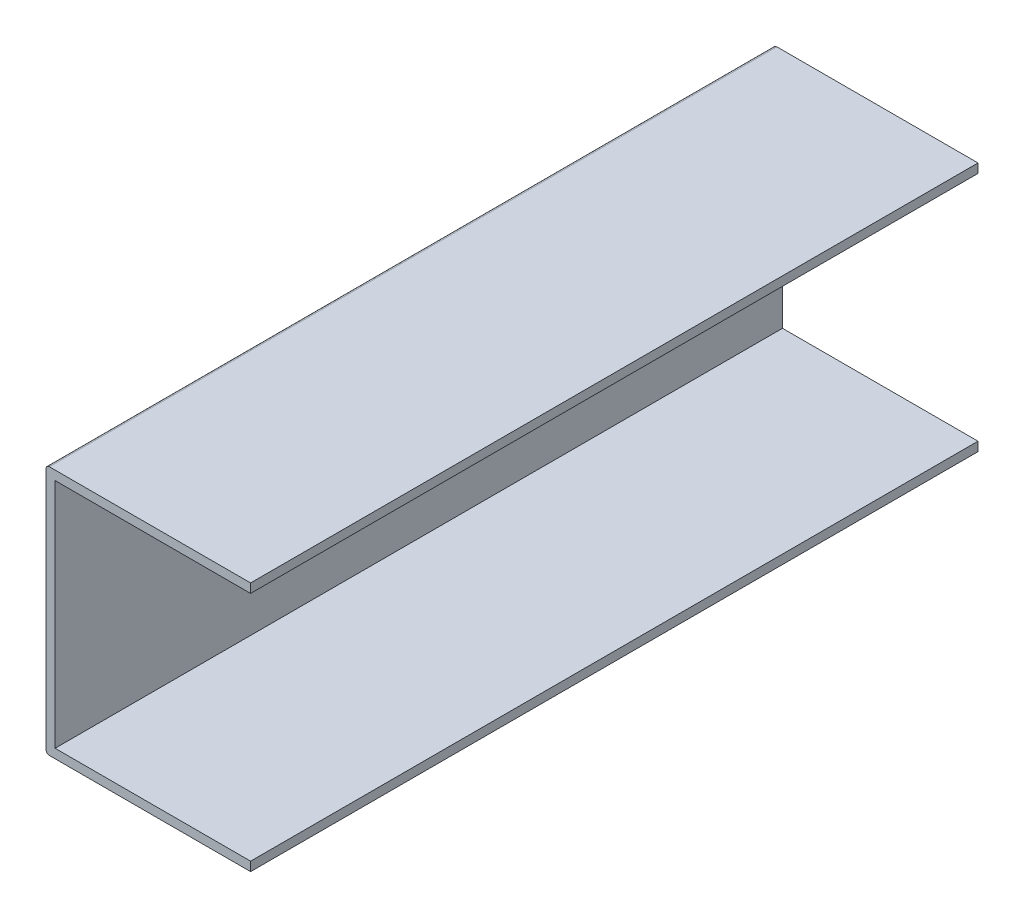
ISO-10303-21;
HEADER;
FILE_DESCRIPTION(('STEP AP214'),'2;1');
FILE_NAME('part.step','',(''),(''),'','','');
FILE_SCHEMA(('AUTOMOTIVE_DESIGN { 1 0 10303 214 1 1 1 1 }'));
ENDSEC;
DATA;
#1=APPLICATION_CONTEXT('core data for automotive mechanical design processes');
#2=APPLICATION_PROTOCOL_DEFINITION('international standard','automotive_design',2000,#1);
#3=PRODUCT_CONTEXT('',#1,'mechanical');
#4=PRODUCT('Part','Part','',(#3));
#5=PRODUCT_RELATED_PRODUCT_CATEGORY('part','',(#4));
#6=PRODUCT_DEFINITION_FORMATION('','',#4);
#7=PRODUCT_DEFINITION_CONTEXT('part definition',#1,'design');
#8=PRODUCT_DEFINITION('design','',#6,#7);
#9=PRODUCT_DEFINITION_SHAPE('','',#8);
#10=(LENGTH_UNIT() NAMED_UNIT(*) SI_UNIT(.MILLI.,.METRE.));
#11=(NAMED_UNIT(*) PLANE_ANGLE_UNIT() SI_UNIT($,.RADIAN.));
#12=(NAMED_UNIT(*) SI_UNIT($,.STERADIAN.) SOLID_ANGLE_UNIT());
#13=UNCERTAINTY_MEASURE_WITH_UNIT(LENGTH_MEASURE(1.E-05),#10,'distance_accuracy_value','');
#14=(GEOMETRIC_REPRESENTATION_CONTEXT(3) GLOBAL_UNCERTAINTY_ASSIGNED_CONTEXT((#13)) GLOBAL_UNIT_ASSIGNED_CONTEXT((#10,
#11,#12)) REPRESENTATION_CONTEXT('',''));
#15=CARTESIAN_POINT('',(0.,0.,0.));
#16=DIRECTION('',(0.,0.,1.));
#17=DIRECTION('',(1.,0.,0.));
#18=AXIS2_PLACEMENT_3D('',#15,#16,#17);
#19=CARTESIAN_POINT('',(-0.205,0.,-1.6));
#20=DIRECTION('',(-1.,0.,0.));
#21=DIRECTION('',(0.,1.,0.));
#22=AXIS2_PLACEMENT_3D('',#19,#20,#21);
#23=PLANE('',#22);
#24=DIRECTION('',(0.,0.,-1.));
#25=VECTOR('',#24,1.);
#26=CARTESIAN_POINT('',(-0.205,-0.255,-1.6));
#27=LINE('',#26,#25);
#28=CARTESIAN_POINT('',(-0.205,-0.255,0.));
#29=VERTEX_POINT('',#28);
#30=CARTESIAN_POINT('',(-0.205,-0.255,-1.6));
#31=VERTEX_POINT('',#30);
#32=EDGE_CURVE('E28',#29,#31,#27,.T.);
#33=ORIENTED_EDGE('',*,*,#32,.T.);
#34=DIRECTION('',(0.,-1.,0.));
#35=VECTOR('',#34,1.);
#36=CARTESIAN_POINT('',(-0.205,0.,-1.6));
#37=LINE('',#36,#35);
#38=CARTESIAN_POINT('',(-0.205,0.255,-1.6));
#39=VERTEX_POINT('',#38);
#40=EDGE_CURVE('E204',#39,#31,#37,.T.);
#41=ORIENTED_EDGE('',*,*,#40,.F.);
#42=DIRECTION('',(0.,0.,-1.));
#43=VECTOR('',#42,1.);
#44=CARTESIAN_POINT('',(-0.205,0.255,-1.6));
#45=LINE('',#44,#43);
#46=CARTESIAN_POINT('',(-0.205,0.255,0.));
#47=VERTEX_POINT('',#46);
#48=EDGE_CURVE('E11',#47,#39,#45,.T.);
#49=ORIENTED_EDGE('',*,*,#48,.F.);
#50=DIRECTION('',(0.,1.,0.));
#51=VECTOR('',#50,1.);
#52=CARTESIAN_POINT('',(-0.205,0.,0.));
#53=LINE('',#52,#51);
#54=EDGE_CURVE('E214',#29,#47,#53,.T.);
#55=ORIENTED_EDGE('',*,*,#54,.F.);
#56=EDGE_LOOP('',(#33,#41,#49,#55));
#57=FACE_BOUND('',#56,.T.);
#58=ADVANCED_FACE('F17',(#57),#23,.F.);
#59=CARTESIAN_POINT('',(0.,0.255,-1.6));
#60=DIRECTION('',(0.,-1.,0.));
#61=DIRECTION('',(0.,0.,-1.));
#62=AXIS2_PLACEMENT_3D('',#59,#60,#61);
#63=PLANE('',#62);
#64=DIRECTION('',(1.,0.,0.));
#65=VECTOR('',#64,1.);
#66=CARTESIAN_POINT('',(0.,0.255,-1.6));
#67=LINE('',#66,#65);
#68=CARTESIAN_POINT('',(0.225,0.255,-1.6));
#69=VERTEX_POINT('',#68);
#70=EDGE_CURVE('E225',#39,#69,#67,.T.);
#71=ORIENTED_EDGE('',*,*,#70,.T.);
#72=DIRECTION('',(0.,0.,-1.));
#73=VECTOR('',#72,1.);
#74=CARTESIAN_POINT('',(0.225,0.255,-1.6));
#75=LINE('',#74,#73);
#76=CARTESIAN_POINT('',(0.225,0.255,0.));
#77=VERTEX_POINT('',#76);
#78=EDGE_CURVE('E42',#77,#69,#75,.T.);
#79=ORIENTED_EDGE('',*,*,#78,.F.);
#80=DIRECTION('',(-1.,0.,0.));
#81=VECTOR('',#80,1.);
#82=CARTESIAN_POINT('',(0.,0.255,0.));
#83=LINE('',#82,#81);
#84=EDGE_CURVE('E192',#77,#47,#83,.T.);
#85=ORIENTED_EDGE('',*,*,#84,.T.);
#86=ORIENTED_EDGE('',*,*,#48,.T.);
#87=EDGE_LOOP('',(#71,#79,#85,#86));
#88=FACE_BOUND('',#87,.T.);
#89=ADVANCED_FACE('F417',(#88),#63,.T.);
#90=CARTESIAN_POINT('',(0.,-0.255,-1.6));
#91=DIRECTION('',(0.,-1.,0.));
#92=DIRECTION('',(0.,0.,-1.));
#93=AXIS2_PLACEMENT_3D('',#90,#91,#92);
#94=PLANE('',#93);
#95=DIRECTION('',(0.,0.,1.));
#96=VECTOR('',#95,1.);
#97=CARTESIAN_POINT('',(0.225,-0.255,-1.6));
#98=LINE('',#97,#96);
#99=CARTESIAN_POINT('',(0.225,-0.255,-1.6));
#100=VERTEX_POINT('',#99);
#101=CARTESIAN_POINT('',(0.225,-0.255,0.));
#102=VERTEX_POINT('',#101);
#103=EDGE_CURVE('E220',#100,#102,#98,.T.);
#104=ORIENTED_EDGE('',*,*,#103,.F.);
#105=DIRECTION('',(1.,0.,0.));
#106=VECTOR('',#105,1.);
#107=CARTESIAN_POINT('',(0.,-0.255,-1.6));
#108=LINE('',#107,#106);
#109=EDGE_CURVE('E200',#31,#100,#108,.T.);
#110=ORIENTED_EDGE('',*,*,#109,.F.);
#111=ORIENTED_EDGE('',*,*,#32,.F.);
#112=DIRECTION('',(-1.,0.,0.));
#113=VECTOR('',#112,1.);
#114=CARTESIAN_POINT('',(0.,-0.255,0.));
#115=LINE('',#114,#113);
#116=EDGE_CURVE('E210',#102,#29,#115,.T.);
#117=ORIENTED_EDGE('',*,*,#116,.F.);
#118=EDGE_LOOP('',(#104,#110,#111,#117));
#119=FACE_BOUND('',#118,.T.);
#120=ADVANCED_FACE('F253',(#119),#94,.F.);
#121=CARTESIAN_POINT('',(0.225,0.,-1.6));
#122=DIRECTION('',(1.,0.,0.));
#123=DIRECTION('',(0.,1.,0.));
#124=AXIS2_PLACEMENT_3D('',#121,#122,#123);
#125=PLANE('',#124);
#126=DIRECTION('',(0.,1.,0.));
#127=VECTOR('',#126,1.);
#128=CARTESIAN_POINT('',(0.225,0.,-1.6));
#129=LINE('',#128,#127);
#130=CARTESIAN_POINT('',(0.225,0.275,-1.6));
#131=VERTEX_POINT('',#130);
#132=EDGE_CURVE('E173',#69,#131,#129,.T.);
#133=ORIENTED_EDGE('',*,*,#132,.T.);
#134=DIRECTION('',(0.,0.,1.));
#135=VECTOR('',#134,1.);
#136=CARTESIAN_POINT('',(0.225,0.275,-1.6));
#137=LINE('',#136,#135);
#138=CARTESIAN_POINT('',(0.225,0.275,0.));
#139=VERTEX_POINT('',#138);
#140=EDGE_CURVE('E95',#131,#139,#137,.T.);
#141=ORIENTED_EDGE('',*,*,#140,.T.);
#142=DIRECTION('',(0.,-1.,0.));
#143=VECTOR('',#142,1.);
#144=CARTESIAN_POINT('',(0.225,0.,0.));
#145=LINE('',#144,#143);
#146=EDGE_CURVE('E190',#139,#77,#145,.T.);
#147=ORIENTED_EDGE('',*,*,#146,.T.);
#148=ORIENTED_EDGE('',*,*,#78,.T.);
#149=EDGE_LOOP('',(#133,#141,#147,#148));
#150=FACE_BOUND('',#149,.T.);
#151=ADVANCED_FACE('F400',(#150),#125,.T.);
#152=CARTESIAN_POINT('',(0.225,0.,-1.6));
#153=DIRECTION('',(1.,0.,0.));
#154=DIRECTION('',(0.,1.,0.));
#155=AXIS2_PLACEMENT_3D('',#152,#153,#154);
#156=PLANE('',#155);
#157=DIRECTION('',(0.,1.,0.));
#158=VECTOR('',#157,1.);
#159=CARTESIAN_POINT('',(0.225,0.,-1.6));
#160=LINE('',#159,#158);
#161=CARTESIAN_POINT('',(0.225,-0.275,-1.6));
#162=VERTEX_POINT('',#161);
#163=EDGE_CURVE('E183',#162,#100,#160,.T.);
#164=ORIENTED_EDGE('',*,*,#163,.T.);
#165=ORIENTED_EDGE('',*,*,#103,.T.);
#166=DIRECTION('',(0.,-1.,0.));
#167=VECTOR('',#166,1.);
#168=CARTESIAN_POINT('',(0.225,0.,0.));
#169=LINE('',#168,#167);
#170=CARTESIAN_POINT('',(0.225,-0.275,0.));
#171=VERTEX_POINT('',#170);
#172=EDGE_CURVE('E189',#102,#171,#169,.T.);
#173=ORIENTED_EDGE('',*,*,#172,.T.);
#174=DIRECTION('',(0.,0.,1.));
#175=VECTOR('',#174,1.);
#176=CARTESIAN_POINT('',(0.225,-0.275,-1.6));
#177=LINE('',#176,#175);
#178=EDGE_CURVE('E184',#162,#171,#177,.T.);
#179=ORIENTED_EDGE('',*,*,#178,.F.);
#180=EDGE_LOOP('',(#164,#165,#173,#179));
#181=FACE_BOUND('',#180,.T.);
#182=ADVANCED_FACE('F248',(#181),#156,.T.);
#183=CARTESIAN_POINT('',(0.,0.275,-1.6));
#184=DIRECTION('',(0.,-1.,0.));
#185=DIRECTION('',(0.,0.,-1.));
#186=AXIS2_PLACEMENT_3D('',#183,#184,#185);
#187=PLANE('',#186);
#188=DIRECTION('',(0.,0.,-1.));
#189=VECTOR('',#188,1.);
#190=CARTESIAN_POINT('',(-0.2175,0.275,-1.6));
#191=LINE('',#190,#189);
#192=CARTESIAN_POINT('',(-0.2175,0.275,0.));
#193=VERTEX_POINT('',#192);
#194=CARTESIAN_POINT('',(-0.2175,0.275,-1.6));
#195=VERTEX_POINT('',#194);
#196=EDGE_CURVE('E120',#193,#195,#191,.T.);
#197=ORIENTED_EDGE('',*,*,#196,.F.);
#198=DIRECTION('',(-1.,0.,0.));
#199=VECTOR('',#198,1.);
#200=CARTESIAN_POINT('',(0.,0.275,0.));
#201=LINE('',#200,#199);
#202=EDGE_CURVE('E149',#139,#193,#201,.T.);
#203=ORIENTED_EDGE('',*,*,#202,.F.);
#204=ORIENTED_EDGE('',*,*,#140,.F.);
#205=DIRECTION('',(1.,0.,0.));
#206=VECTOR('',#205,1.);
#207=CARTESIAN_POINT('',(0.,0.275,-1.6));
#208=LINE('',#207,#206);
#209=EDGE_CURVE('E196',#195,#131,#208,.T.);
#210=ORIENTED_EDGE('',*,*,#209,.F.);
#211=EDGE_LOOP('',(#197,#203,#204,#210));
#212=FACE_BOUND('',#211,.T.);
#213=ADVANCED_FACE('F381',(#212),#187,.F.);
#214=CARTESIAN_POINT('',(0.,-0.275,-1.6));
#215=DIRECTION('',(0.,-1.,0.));
#216=DIRECTION('',(0.,0.,-1.));
#217=AXIS2_PLACEMENT_3D('',#214,#215,#216);
#218=PLANE('',#217);
#219=DIRECTION('',(1.,0.,0.));
#220=VECTOR('',#219,1.);
#221=CARTESIAN_POINT('',(0.,-0.275,-1.6));
#222=LINE('',#221,#220);
#223=CARTESIAN_POINT('',(-0.2175,-0.275,-1.6));
#224=VERTEX_POINT('',#223);
#225=EDGE_CURVE('E178',#224,#162,#222,.T.);
#226=ORIENTED_EDGE('',*,*,#225,.T.);
#227=ORIENTED_EDGE('',*,*,#178,.T.);
#228=DIRECTION('',(1.,0.,0.));
#229=VECTOR('',#228,1.);
#230=CARTESIAN_POINT('',(0.,-0.275,0.));
#231=LINE('',#230,#229);
#232=CARTESIAN_POINT('',(-0.2175,-0.275,0.));
#233=VERTEX_POINT('',#232);
#234=EDGE_CURVE('E83',#233,#171,#231,.T.);
#235=ORIENTED_EDGE('',*,*,#234,.F.);
#236=DIRECTION('',(0.,0.,1.));
#237=VECTOR('',#236,1.);
#238=CARTESIAN_POINT('',(-0.2175,-0.275,-1.6));
#239=LINE('',#238,#237);
#240=EDGE_CURVE('E21',#224,#233,#239,.T.);
#241=ORIENTED_EDGE('',*,*,#240,.F.);
#242=EDGE_LOOP('',(#226,#227,#235,#241));
#243=FACE_BOUND('',#242,.T.);
#244=ADVANCED_FACE('F372',(#243),#218,.T.);
#245=CARTESIAN_POINT('',(-0.2175,0.2675,-1.6));
#246=DIRECTION('',(0.,0.,1.));
#247=DIRECTION('',(1.,0.,0.));
#248=AXIS2_PLACEMENT_3D('',#245,#246,#247);
#249=CYLINDRICAL_SURFACE('',#248,0.0075);
#250=CARTESIAN_POINT('',(-0.2175,0.2675,0.));
#251=DIRECTION('',(0.,0.,1.));
#252=DIRECTION('',(1.,0.,0.));
#253=AXIS2_PLACEMENT_3D('',#250,#251,#252);
#254=CIRCLE('',#253,0.0075);
#255=CARTESIAN_POINT('',(-0.225,0.2675,0.));
#256=VERTEX_POINT('',#255);
#257=EDGE_CURVE('E141',#193,#256,#254,.T.);
#258=ORIENTED_EDGE('',*,*,#257,.F.);
#259=ORIENTED_EDGE('',*,*,#196,.T.);
#260=CARTESIAN_POINT('',(-0.2175,0.2675,-1.6));
#261=DIRECTION('',(0.,0.,1.));
#262=DIRECTION('',(1.,0.,0.));
#263=AXIS2_PLACEMENT_3D('',#260,#261,#262);
#264=CIRCLE('',#263,0.0075);
#265=CARTESIAN_POINT('',(-0.225,0.2675,-1.6));
#266=VERTEX_POINT('',#265);
#267=EDGE_CURVE('E156',#195,#266,#264,.T.);
#268=ORIENTED_EDGE('',*,*,#267,.T.);
#269=DIRECTION('',(0.,0.,1.));
#270=VECTOR('',#269,1.);
#271=CARTESIAN_POINT('',(-0.225,0.2675,-1.6));
#272=LINE('',#271,#270);
#273=EDGE_CURVE('E153',#266,#256,#272,.T.);
#274=ORIENTED_EDGE('',*,*,#273,.T.);
#275=EDGE_LOOP('',(#258,#259,#268,#274));
#276=FACE_BOUND('',#275,.T.);
#277=ADVANCED_FACE('F154',(#276),#249,.T.);
#278=CARTESIAN_POINT('',(0.,0.,0.));
#279=DIRECTION('',(0.,0.,1.));
#280=DIRECTION('',(1.,0.,0.));
#281=AXIS2_PLACEMENT_3D('',#278,#279,#280);
#282=PLANE('',#281);
#283=ORIENTED_EDGE('',*,*,#202,.T.);
#284=ORIENTED_EDGE('',*,*,#257,.T.);
#285=DIRECTION('',(0.,-1.,0.));
#286=VECTOR('',#285,1.);
#287=CARTESIAN_POINT('',(-0.225,0.,0.));
#288=LINE('',#287,#286);
#289=CARTESIAN_POINT('',(-0.225,-0.2675,0.));
#290=VERTEX_POINT('',#289);
#291=EDGE_CURVE('E146',#256,#290,#288,.T.);
#292=ORIENTED_EDGE('',*,*,#291,.T.);
#293=CARTESIAN_POINT('',(-0.2175,-0.2675,0.));
#294=DIRECTION('',(0.,0.,-1.));
#295=DIRECTION('',(-1.,0.,0.));
#296=AXIS2_PLACEMENT_3D('',#293,#294,#295);
#297=CIRCLE('',#296,0.0075);
#298=EDGE_CURVE('E175',#233,#290,#297,.T.);
#299=ORIENTED_EDGE('',*,*,#298,.F.);
#300=ORIENTED_EDGE('',*,*,#234,.T.);
#301=ORIENTED_EDGE('',*,*,#172,.F.);
#302=ORIENTED_EDGE('',*,*,#116,.T.);
#303=ORIENTED_EDGE('',*,*,#54,.T.);
#304=ORIENTED_EDGE('',*,*,#84,.F.);
#305=ORIENTED_EDGE('',*,*,#146,.F.);
#306=EDGE_LOOP('',(#283,#284,#292,#299,#300,#301,#302,#303,#304,#305));
#307=FACE_BOUND('',#306,.T.);
#308=ADVANCED_FACE('F143',(#307),#282,.T.);
#309=CARTESIAN_POINT('',(-0.2175,-0.2675,-1.6));
#310=DIRECTION('',(0.,0.,-1.));
#311=DIRECTION('',(-1.,0.,0.));
#312=AXIS2_PLACEMENT_3D('',#309,#310,#311);
#313=CYLINDRICAL_SURFACE('',#312,0.0075);
#314=ORIENTED_EDGE('',*,*,#298,.T.);
#315=DIRECTION('',(0.,0.,-1.));
#316=VECTOR('',#315,1.);
#317=CARTESIAN_POINT('',(-0.225,-0.2675,-1.6));
#318=LINE('',#317,#316);
#319=CARTESIAN_POINT('',(-0.225,-0.2675,-1.6));
#320=VERTEX_POINT('',#319);
#321=EDGE_CURVE('E163',#290,#320,#318,.T.);
#322=ORIENTED_EDGE('',*,*,#321,.T.);
#323=CARTESIAN_POINT('',(-0.2175,-0.2675,-1.6));
#324=DIRECTION('',(0.,0.,1.));
#325=DIRECTION('',(-1.,0.,0.));
#326=AXIS2_PLACEMENT_3D('',#323,#324,#325);
#327=CIRCLE('',#326,0.0075);
#328=EDGE_CURVE('E134',#320,#224,#327,.T.);
#329=ORIENTED_EDGE('',*,*,#328,.T.);
#330=ORIENTED_EDGE('',*,*,#240,.T.);
#331=EDGE_LOOP('',(#314,#322,#329,#330));
#332=FACE_BOUND('',#331,.T.);
#333=ADVANCED_FACE('F255',(#332),#313,.T.);
#334=CARTESIAN_POINT('',(0.,0.,-1.6));
#335=DIRECTION('',(0.,0.,1.));
#336=DIRECTION('',(1.,0.,0.));
#337=AXIS2_PLACEMENT_3D('',#334,#335,#336);
#338=PLANE('',#337);
#339=ORIENTED_EDGE('',*,*,#328,.F.);
#340=DIRECTION('',(0.,1.,0.));
#341=VECTOR('',#340,1.);
#342=CARTESIAN_POINT('',(-0.225,0.,-1.6));
#343=LINE('',#342,#341);
#344=EDGE_CURVE('E159',#320,#266,#343,.T.);
#345=ORIENTED_EDGE('',*,*,#344,.T.);
#346=ORIENTED_EDGE('',*,*,#267,.F.);
#347=ORIENTED_EDGE('',*,*,#209,.T.);
#348=ORIENTED_EDGE('',*,*,#132,.F.);
#349=ORIENTED_EDGE('',*,*,#70,.F.);
#350=ORIENTED_EDGE('',*,*,#40,.T.);
#351=ORIENTED_EDGE('',*,*,#109,.T.);
#352=ORIENTED_EDGE('',*,*,#163,.F.);
#353=ORIENTED_EDGE('',*,*,#225,.F.);
#354=EDGE_LOOP('',(#339,#345,#346,#347,#348,#349,#350,#351,#352,#353));
#355=FACE_BOUND('',#354,.T.);
#356=ADVANCED_FACE('F19',(#355),#338,.F.);
#357=CARTESIAN_POINT('',(-0.225,0.,-1.6));
#358=DIRECTION('',(1.,0.,0.));
#359=DIRECTION('',(0.,1.,0.));
#360=AXIS2_PLACEMENT_3D('',#357,#358,#359);
#361=PLANE('',#360);
#362=ORIENTED_EDGE('',*,*,#321,.F.);
#363=ORIENTED_EDGE('',*,*,#291,.F.);
#364=ORIENTED_EDGE('',*,*,#273,.F.);
#365=ORIENTED_EDGE('',*,*,#344,.F.);
#366=EDGE_LOOP('',(#362,#363,#364,#365));
#367=FACE_BOUND('',#366,.T.);
#368=ADVANCED_FACE('F161',(#367),#361,.F.);
#369=CLOSED_SHELL('',(#58,#89,#120,#151,#182,#213,#244,#277,#308,#333,#356,#368));
#370=MANIFOLD_SOLID_BREP('B1',#369);
#371=ADVANCED_BREP_SHAPE_REPRESENTATION('',(#18,#370),#14);
#372=SHAPE_DEFINITION_REPRESENTATION(#9,#371);
ENDSEC;
END-ISO-10303-21;
